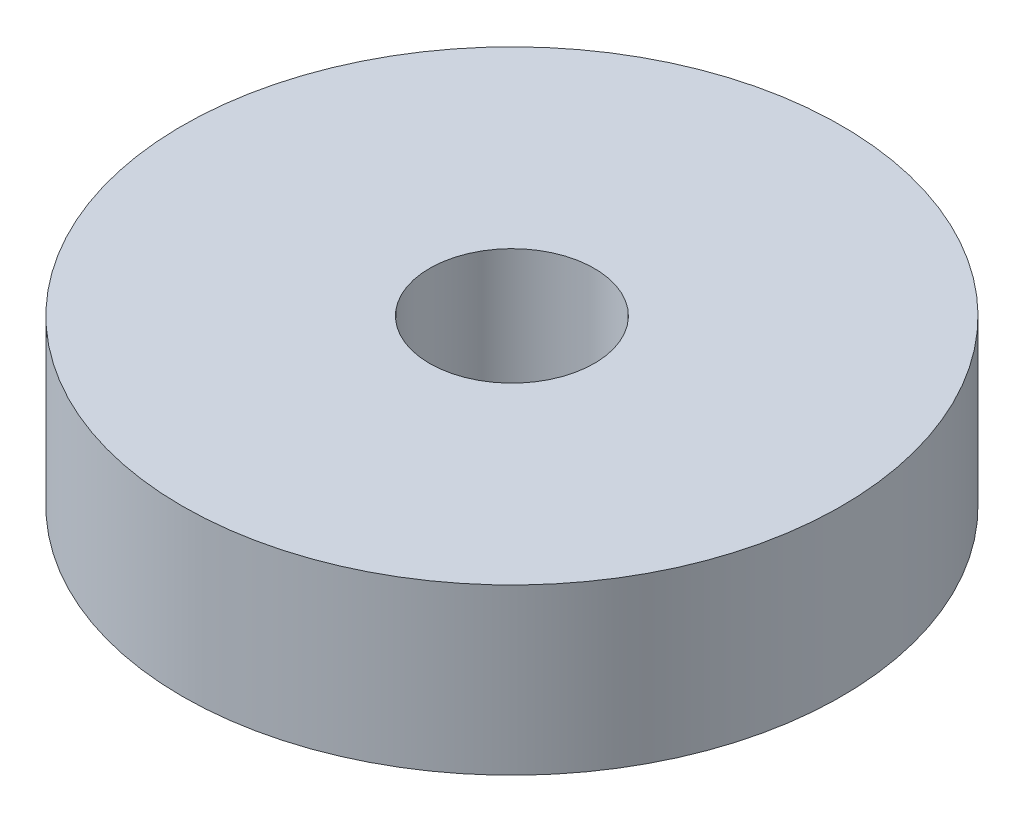
ISO-10303-21;
HEADER;
FILE_DESCRIPTION(('STEP AP214'),'2;1');
FILE_NAME('part.step','',(''),(''),'','','');
FILE_SCHEMA(('AUTOMOTIVE_DESIGN { 1 0 10303 214 1 1 1 1 }'));
ENDSEC;
DATA;
#1=APPLICATION_CONTEXT('core data for automotive mechanical design processes');
#2=APPLICATION_PROTOCOL_DEFINITION('international standard','automotive_design',2000,#1);
#3=PRODUCT_CONTEXT('',#1,'mechanical');
#4=PRODUCT('Part','Part','',(#3));
#5=PRODUCT_RELATED_PRODUCT_CATEGORY('part','',(#4));
#6=PRODUCT_DEFINITION_FORMATION('','',#4);
#7=PRODUCT_DEFINITION_CONTEXT('part definition',#1,'design');
#8=PRODUCT_DEFINITION('design','',#6,#7);
#9=PRODUCT_DEFINITION_SHAPE('','',#8);
#10=(LENGTH_UNIT() NAMED_UNIT(*) SI_UNIT(.MILLI.,.METRE.));
#11=(NAMED_UNIT(*) PLANE_ANGLE_UNIT() SI_UNIT($,.RADIAN.));
#12=(NAMED_UNIT(*) SI_UNIT($,.STERADIAN.) SOLID_ANGLE_UNIT());
#13=UNCERTAINTY_MEASURE_WITH_UNIT(LENGTH_MEASURE(1.E-05),#10,'distance_accuracy_value','');
#14=(GEOMETRIC_REPRESENTATION_CONTEXT(3) GLOBAL_UNCERTAINTY_ASSIGNED_CONTEXT((#13)) GLOBAL_UNIT_ASSIGNED_CONTEXT((#10,
#11,#12)) REPRESENTATION_CONTEXT('',''));
#15=CARTESIAN_POINT('',(0.,0.,0.));
#16=DIRECTION('',(0.,0.,1.));
#17=DIRECTION('',(1.,0.,0.));
#18=AXIS2_PLACEMENT_3D('',#15,#16,#17);
#19=CARTESIAN_POINT('',(0.,50.,0.));
#20=DIRECTION('',(0.,-1.,0.));
#21=DIRECTION('',(0.,0.,-1.));
#22=AXIS2_PLACEMENT_3D('',#19,#20,#21);
#23=CYLINDRICAL_SURFACE('',#22,100.);
#24=CARTESIAN_POINT('',(0.,50.,0.));
#25=DIRECTION('',(0.,1.,0.));
#26=DIRECTION('',(0.,0.,1.));
#27=AXIS2_PLACEMENT_3D('',#24,#25,#26);
#28=CIRCLE('',#27,100.);
#29=CARTESIAN_POINT('',(0.,50.,100.));
#30=VERTEX_POINT('',#29);
#31=EDGE_CURVE('E10',#30,#30,#28,.T.);
#32=ORIENTED_EDGE('',*,*,#31,.F.);
#33=EDGE_LOOP('',(#32));
#34=FACE_BOUND('',#33,.T.);
#35=CARTESIAN_POINT('',(0.,0.,0.));
#36=DIRECTION('',(0.,1.,0.));
#37=DIRECTION('',(0.,0.,1.));
#38=AXIS2_PLACEMENT_3D('',#35,#36,#37);
#39=CIRCLE('',#38,100.);
#40=CARTESIAN_POINT('',(0.,0.,100.));
#41=VERTEX_POINT('',#40);
#42=EDGE_CURVE('E40',#41,#41,#39,.T.);
#43=ORIENTED_EDGE('',*,*,#42,.T.);
#44=EDGE_LOOP('',(#43));
#45=FACE_BOUND('',#44,.T.);
#46=ADVANCED_FACE('F37',(#34,#45),#23,.T.);
#47=CARTESIAN_POINT('',(0.,50.,0.));
#48=DIRECTION('',(0.,1.,0.));
#49=DIRECTION('',(0.,0.,1.));
#50=AXIS2_PLACEMENT_3D('',#47,#48,#49);
#51=PLANE('',#50);
#52=CARTESIAN_POINT('',(0.,50.,0.));
#53=DIRECTION('',(0.,1.,0.));
#54=DIRECTION('',(0.,0.,1.));
#55=AXIS2_PLACEMENT_3D('',#52,#53,#54);
#56=CIRCLE('',#55,25.);
#57=CARTESIAN_POINT('',(0.,50.,25.));
#58=VERTEX_POINT('',#57);
#59=EDGE_CURVE('E51',#58,#58,#56,.T.);
#60=ORIENTED_EDGE('',*,*,#59,.F.);
#61=EDGE_LOOP('',(#60));
#62=FACE_BOUND('',#61,.T.);
#63=ORIENTED_EDGE('',*,*,#31,.T.);
#64=EDGE_LOOP('',(#63));
#65=FACE_BOUND('',#64,.T.);
#66=ADVANCED_FACE('F68',(#62,#65),#51,.T.);
#67=CARTESIAN_POINT('',(0.,0.,0.));
#68=DIRECTION('',(0.,1.,0.));
#69=DIRECTION('',(0.,0.,1.));
#70=AXIS2_PLACEMENT_3D('',#67,#68,#69);
#71=PLANE('',#70);
#72=CARTESIAN_POINT('',(0.,0.,0.));
#73=DIRECTION('',(0.,1.,0.));
#74=DIRECTION('',(0.,0.,1.));
#75=AXIS2_PLACEMENT_3D('',#72,#73,#74);
#76=CIRCLE('',#75,25.);
#77=CARTESIAN_POINT('',(0.,0.,25.));
#78=VERTEX_POINT('',#77);
#79=EDGE_CURVE('E49',#78,#78,#76,.T.);
#80=ORIENTED_EDGE('',*,*,#79,.T.);
#81=EDGE_LOOP('',(#80));
#82=FACE_BOUND('',#81,.T.);
#83=ORIENTED_EDGE('',*,*,#42,.F.);
#84=EDGE_LOOP('',(#83));
#85=FACE_BOUND('',#84,.T.);
#86=ADVANCED_FACE('F59',(#82,#85),#71,.F.);
#87=CARTESIAN_POINT('',(0.,0.,0.));
#88=DIRECTION('',(0.,1.,0.));
#89=DIRECTION('',(0.,0.,1.));
#90=AXIS2_PLACEMENT_3D('',#87,#88,#89);
#91=CYLINDRICAL_SURFACE('',#90,25.);
#92=ORIENTED_EDGE('',*,*,#79,.F.);
#93=EDGE_LOOP('',(#92));
#94=FACE_BOUND('',#93,.T.);
#95=ORIENTED_EDGE('',*,*,#59,.T.);
#96=EDGE_LOOP('',(#95));
#97=FACE_BOUND('',#96,.T.);
#98=ADVANCED_FACE('F62',(#94,#97),#91,.F.);
#99=CLOSED_SHELL('',(#46,#66,#86,#98));
#100=MANIFOLD_SOLID_BREP('B2',#99);
#101=ADVANCED_BREP_SHAPE_REPRESENTATION('',(#18,#100),#14);
#102=SHAPE_DEFINITION_REPRESENTATION(#9,#101);
ENDSEC;
END-ISO-10303-21;
